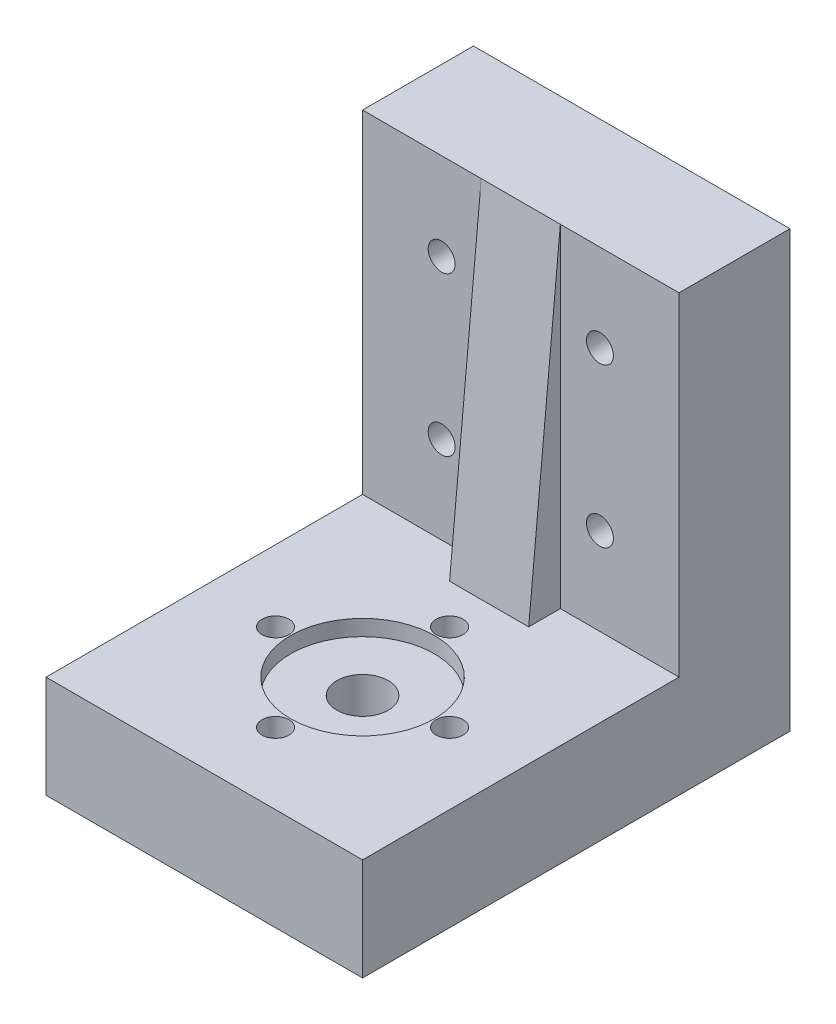
ISO-10303-21;
HEADER;
FILE_DESCRIPTION(('STEP AP214'),'2;1');
FILE_NAME('part.step','',(''),(''),'','','');
FILE_SCHEMA(('AUTOMOTIVE_DESIGN { 1 0 10303 214 1 1 1 1 }'));
ENDSEC;
DATA;
#1=APPLICATION_CONTEXT('core data for automotive mechanical design processes');
#2=APPLICATION_PROTOCOL_DEFINITION('international standard','automotive_design',2000,#1);
#3=PRODUCT_CONTEXT('',#1,'mechanical');
#4=PRODUCT('Part','Part','',(#3));
#5=PRODUCT_RELATED_PRODUCT_CATEGORY('part','',(#4));
#6=PRODUCT_DEFINITION_FORMATION('','',#4);
#7=PRODUCT_DEFINITION_CONTEXT('part definition',#1,'design');
#8=PRODUCT_DEFINITION('design','',#6,#7);
#9=PRODUCT_DEFINITION_SHAPE('','',#8);
#10=(LENGTH_UNIT() NAMED_UNIT(*) SI_UNIT(.MILLI.,.METRE.));
#11=(NAMED_UNIT(*) PLANE_ANGLE_UNIT() SI_UNIT($,.RADIAN.));
#12=(NAMED_UNIT(*) SI_UNIT($,.STERADIAN.) SOLID_ANGLE_UNIT());
#13=UNCERTAINTY_MEASURE_WITH_UNIT(LENGTH_MEASURE(1.E-05),#10,'distance_accuracy_value','');
#14=(GEOMETRIC_REPRESENTATION_CONTEXT(3) GLOBAL_UNCERTAINTY_ASSIGNED_CONTEXT((#13)) GLOBAL_UNIT_ASSIGNED_CONTEXT((#10,
#11,#12)) REPRESENTATION_CONTEXT('',''));
#15=CARTESIAN_POINT('',(0.,0.,0.));
#16=DIRECTION('',(0.,0.,1.));
#17=DIRECTION('',(1.,0.,0.));
#18=AXIS2_PLACEMENT_3D('',#15,#16,#17);
#19=CARTESIAN_POINT('',(20.,-14.9081147540984,-10.9095901639344));
#20=DIRECTION('',(0.,0.,-1.));
#21=DIRECTION('',(0.,1.,0.));
#22=AXIS2_PLACEMENT_3D('',#19,#20,#21);
#23=PLANE('',#22);
#24=CARTESIAN_POINT('',(10.,16.1268852459017,-10.9095901639344));
#25=DIRECTION('',(0.,0.,1.));
#26=DIRECTION('',(1.,0.,0.));
#27=AXIS2_PLACEMENT_3D('',#24,#25,#26);
#28=CIRCLE('',#27,1.7);
#29=CARTESIAN_POINT('',(11.7,16.1268852459017,-10.9095901639344));
#30=VERTEX_POINT('',#29);
#31=EDGE_CURVE('E145',#30,#30,#28,.T.);
#32=ORIENTED_EDGE('',*,*,#31,.F.);
#33=EDGE_LOOP('',(#32));
#34=FACE_BOUND('',#33,.T.);
#35=CARTESIAN_POINT('',(10.0000000000002,-3.87311475409835,-10.9095901639344));
#36=DIRECTION('',(0.,0.,1.));
#37=DIRECTION('',(1.,0.,0.));
#38=AXIS2_PLACEMENT_3D('',#35,#36,#37);
#39=CIRCLE('',#38,1.7);
#40=CARTESIAN_POINT('',(11.7000000000002,-3.87311475409835,-10.9095901639344));
#41=VERTEX_POINT('',#40);
#42=EDGE_CURVE('E148',#41,#41,#39,.T.);
#43=ORIENTED_EDGE('',*,*,#42,.F.);
#44=EDGE_LOOP('',(#43));
#45=FACE_BOUND('',#44,.T.);
#46=DIRECTION('',(0.,1.,0.));
#47=VECTOR('',#46,1.);
#48=CARTESIAN_POINT('',(5.,-14.9081147540984,-10.9095901639344));
#49=LINE('',#48,#47);
#50=CARTESIAN_POINT('',(5.,-14.9081147540984,-10.9095901639344));
#51=VERTEX_POINT('',#50);
#52=CARTESIAN_POINT('',(5.,27.1618852459017,-10.9095901639344));
#53=VERTEX_POINT('',#52);
#54=EDGE_CURVE('E121',#51,#53,#49,.T.);
#55=ORIENTED_EDGE('',*,*,#54,.F.);
#56=DIRECTION('',(-1.,0.,0.));
#57=VECTOR('',#56,1.);
#58=CARTESIAN_POINT('',(20.,-14.9081147540984,-10.9095901639344));
#59=LINE('',#58,#57);
#60=CARTESIAN_POINT('',(20.,-14.9081147540984,-10.9095901639344));
#61=VERTEX_POINT('',#60);
#62=EDGE_CURVE('E115',#61,#51,#59,.T.);
#63=ORIENTED_EDGE('',*,*,#62,.F.);
#64=DIRECTION('',(0.,-1.,0.));
#65=VECTOR('',#64,1.);
#66=CARTESIAN_POINT('',(20.,-14.9081147540984,-10.9095901639344));
#67=LINE('',#66,#65);
#68=CARTESIAN_POINT('',(20.,27.1618852459017,-10.9095901639344));
#69=VERTEX_POINT('',#68);
#70=EDGE_CURVE('E205',#69,#61,#67,.T.);
#71=ORIENTED_EDGE('',*,*,#70,.F.);
#72=DIRECTION('',(-1.,0.,0.));
#73=VECTOR('',#72,1.);
#74=CARTESIAN_POINT('',(20.,27.1618852459017,-10.9095901639344));
#75=LINE('',#74,#73);
#76=EDGE_CURVE('E11',#69,#53,#75,.T.);
#77=ORIENTED_EDGE('',*,*,#76,.T.);
#78=EDGE_LOOP('',(#55,#63,#71,#77));
#79=FACE_BOUND('',#78,.T.);
#80=ADVANCED_FACE('F39',(#34,#45,#79),#23,.F.);
#81=CARTESIAN_POINT('',(0.,-27.8381147540984,9.09040983606557));
#82=DIRECTION('',(0.,1.,0.));
#83=DIRECTION('',(0.,0.,1.));
#84=AXIS2_PLACEMENT_3D('',#81,#82,#83);
#85=CYLINDRICAL_SURFACE('',#84,3.25);
#86=CARTESIAN_POINT('',(0.,-27.8381147540984,9.09040983606557));
#87=DIRECTION('',(0.,1.,0.));
#88=DIRECTION('',(0.,0.,1.));
#89=AXIS2_PLACEMENT_3D('',#86,#87,#88);
#90=CIRCLE('',#89,3.25);
#91=CARTESIAN_POINT('',(0.,-27.8381147540984,12.3404098360656));
#92=VERTEX_POINT('',#91);
#93=EDGE_CURVE('E194',#92,#92,#90,.T.);
#94=ORIENTED_EDGE('',*,*,#93,.F.);
#95=EDGE_LOOP('',(#94));
#96=FACE_BOUND('',#95,.T.);
#97=CARTESIAN_POINT('',(0.,-16.9081147540984,9.09040983606557));
#98=DIRECTION('',(0.,1.,0.));
#99=DIRECTION('',(0.,0.,1.));
#100=AXIS2_PLACEMENT_3D('',#97,#98,#99);
#101=CIRCLE('',#100,3.25);
#102=CARTESIAN_POINT('',(0.,-16.9081147540984,12.3404098360656));
#103=VERTEX_POINT('',#102);
#104=EDGE_CURVE('E43',#103,#103,#101,.F.);
#105=ORIENTED_EDGE('',*,*,#104,.F.);
#106=EDGE_LOOP('',(#105));
#107=FACE_BOUND('',#106,.T.);
#108=ADVANCED_FACE('F258',(#96,#107),#85,.F.);
#109=CARTESIAN_POINT('',(20.,27.1618852459017,-10.9095901639344));
#110=DIRECTION('',(0.,-1.,0.));
#111=DIRECTION('',(0.,0.,-1.));
#112=AXIS2_PLACEMENT_3D('',#109,#110,#111);
#113=PLANE('',#112);
#114=CARTESIAN_POINT('',(-5.,27.1618852459017,-10.9095901639344));
#115=VERTEX_POINT('',#114);
#116=CARTESIAN_POINT('',(-20.,27.1618852459017,-10.9095901639344));
#117=VERTEX_POINT('',#116);
#118=EDGE_CURVE('E48',#115,#117,#75,.T.);
#119=ORIENTED_EDGE('',*,*,#118,.F.);
#120=DIRECTION('',(-1.,0.,0.));
#121=VECTOR('',#120,1.);
#122=CARTESIAN_POINT('',(20.,27.1618852459017,-10.9095901639344));
#123=LINE('',#122,#121);
#124=EDGE_CURVE('E65',#115,#53,#123,.F.);
#125=ORIENTED_EDGE('',*,*,#124,.T.);
#126=ORIENTED_EDGE('',*,*,#76,.F.);
#127=DIRECTION('',(0.,0.,1.));
#128=VECTOR('',#127,1.);
#129=CARTESIAN_POINT('',(20.,27.1618852459017,-10.9095901639344));
#130=LINE('',#129,#128);
#131=CARTESIAN_POINT('',(20.,27.1618852459017,-24.9295901639344));
#132=VERTEX_POINT('',#131);
#133=EDGE_CURVE('E197',#132,#69,#130,.T.);
#134=ORIENTED_EDGE('',*,*,#133,.F.);
#135=DIRECTION('',(-1.,0.,0.));
#136=VECTOR('',#135,1.);
#137=CARTESIAN_POINT('',(20.,27.1618852459017,-24.9295901639344));
#138=LINE('',#137,#136);
#139=CARTESIAN_POINT('',(-20.,27.1618852459017,-24.9295901639344));
#140=VERTEX_POINT('',#139);
#141=EDGE_CURVE('E215',#132,#140,#138,.T.);
#142=ORIENTED_EDGE('',*,*,#141,.T.);
#143=DIRECTION('',(0.,0.,1.));
#144=VECTOR('',#143,1.);
#145=CARTESIAN_POINT('',(-20.,27.1618852459017,-10.9095901639344));
#146=LINE('',#145,#144);
#147=EDGE_CURVE('E198',#140,#117,#146,.T.);
#148=ORIENTED_EDGE('',*,*,#147,.T.);
#149=EDGE_LOOP('',(#119,#125,#126,#134,#142,#148));
#150=FACE_BOUND('',#149,.T.);
#151=ADVANCED_FACE('F41',(#150),#113,.F.);
#152=CARTESIAN_POINT('',(-9.99999999999979,-3.87311475409835,-10.9095901639344));
#153=DIRECTION('',(0.,0.,1.));
#154=DIRECTION('',(1.,0.,0.));
#155=AXIS2_PLACEMENT_3D('',#152,#153,#154);
#156=CIRCLE('',#155,1.7);
#157=CARTESIAN_POINT('',(-8.29999999999979,-3.87311475409835,-10.9095901639344));
#158=VERTEX_POINT('',#157);
#159=EDGE_CURVE('E154',#158,#158,#156,.T.);
#160=ORIENTED_EDGE('',*,*,#159,.F.);
#161=EDGE_LOOP('',(#160));
#162=FACE_BOUND('',#161,.T.);
#163=CARTESIAN_POINT('',(-10.,16.1268852459017,-10.9095901639344));
#164=DIRECTION('',(0.,0.,1.));
#165=DIRECTION('',(1.,0.,0.));
#166=AXIS2_PLACEMENT_3D('',#163,#164,#165);
#167=CIRCLE('',#166,1.7);
#168=CARTESIAN_POINT('',(-8.3,16.1268852459017,-10.9095901639344));
#169=VERTEX_POINT('',#168);
#170=EDGE_CURVE('E143',#169,#169,#167,.T.);
#171=ORIENTED_EDGE('',*,*,#170,.F.);
#172=EDGE_LOOP('',(#171));
#173=FACE_BOUND('',#172,.T.);
#174=CARTESIAN_POINT('',(-5.,-14.9081147540984,-10.9095901639344));
#175=VERTEX_POINT('',#174);
#176=CARTESIAN_POINT('',(-20.,-14.9081147540984,-10.9095901639344));
#177=VERTEX_POINT('',#176);
#178=EDGE_CURVE('E122',#175,#177,#59,.T.);
#179=ORIENTED_EDGE('',*,*,#178,.F.);
#180=DIRECTION('',(0.,1.,0.));
#181=VECTOR('',#180,1.);
#182=CARTESIAN_POINT('',(-5.,-14.9081147540984,-10.9095901639344));
#183=LINE('',#182,#181);
#184=EDGE_CURVE('E54',#175,#115,#183,.T.);
#185=ORIENTED_EDGE('',*,*,#184,.T.);
#186=ORIENTED_EDGE('',*,*,#118,.T.);
#187=DIRECTION('',(0.,-1.,0.));
#188=VECTOR('',#187,1.);
#189=CARTESIAN_POINT('',(-20.,-14.9081147540984,-10.9095901639344));
#190=LINE('',#189,#188);
#191=EDGE_CURVE('E214',#117,#177,#190,.T.);
#192=ORIENTED_EDGE('',*,*,#191,.T.);
#193=EDGE_LOOP('',(#179,#185,#186,#192));
#194=FACE_BOUND('',#193,.T.);
#195=ADVANCED_FACE('F241',(#162,#173,#194),#23,.F.);
#196=CARTESIAN_POINT('',(20.,-14.9081147540984,29.0904098360656));
#197=DIRECTION('',(0.,-1.,0.));
#198=DIRECTION('',(0.,0.,-1.));
#199=AXIS2_PLACEMENT_3D('',#196,#197,#198);
#200=PLANE('',#199);
#201=CARTESIAN_POINT('',(0.,-14.9081147540984,-1.90959016393443));
#202=DIRECTION('',(0.,1.,0.));
#203=DIRECTION('',(0.,0.,1.));
#204=AXIS2_PLACEMENT_3D('',#201,#202,#203);
#205=CIRCLE('',#204,1.7);
#206=CARTESIAN_POINT('',(0.,-14.9081147540984,-0.209590163934432));
#207=VERTEX_POINT('',#206);
#208=EDGE_CURVE('E167',#207,#207,#205,.T.);
#209=ORIENTED_EDGE('',*,*,#208,.F.);
#210=EDGE_LOOP('',(#209));
#211=FACE_BOUND('',#210,.T.);
#212=CARTESIAN_POINT('',(11.,-14.9081147540984,9.09040983606557));
#213=DIRECTION('',(0.,1.,0.));
#214=DIRECTION('',(0.,0.,1.));
#215=AXIS2_PLACEMENT_3D('',#212,#213,#214);
#216=CIRCLE('',#215,1.69999999999983);
#217=CARTESIAN_POINT('',(11.,-14.9081147540984,10.7904098360654));
#218=VERTEX_POINT('',#217);
#219=EDGE_CURVE('E173',#218,#218,#216,.T.);
#220=ORIENTED_EDGE('',*,*,#219,.F.);
#221=EDGE_LOOP('',(#220));
#222=FACE_BOUND('',#221,.T.);
#223=CARTESIAN_POINT('',(0.,-14.9081147540984,20.0904098360656));
#224=DIRECTION('',(0.,1.,0.));
#225=DIRECTION('',(0.,0.,1.));
#226=AXIS2_PLACEMENT_3D('',#223,#224,#225);
#227=CIRCLE('',#226,1.69999999999948);
#228=CARTESIAN_POINT('',(0.,-14.9081147540984,21.7904098360651));
#229=VERTEX_POINT('',#228);
#230=EDGE_CURVE('E177',#229,#229,#227,.T.);
#231=ORIENTED_EDGE('',*,*,#230,.F.);
#232=EDGE_LOOP('',(#231));
#233=FACE_BOUND('',#232,.T.);
#234=CARTESIAN_POINT('',(-11.,-14.9081147540984,9.09040983606557));
#235=DIRECTION('',(0.,1.,0.));
#236=DIRECTION('',(0.,0.,1.));
#237=AXIS2_PLACEMENT_3D('',#234,#235,#236);
#238=CIRCLE('',#237,1.69999999999973);
#239=CARTESIAN_POINT('',(-11.,-14.9081147540984,10.7904098360653));
#240=VERTEX_POINT('',#239);
#241=EDGE_CURVE('E184',#240,#240,#238,.T.);
#242=ORIENTED_EDGE('',*,*,#241,.F.);
#243=EDGE_LOOP('',(#242));
#244=FACE_BOUND('',#243,.T.);
#245=CARTESIAN_POINT('',(0.,-14.9081147540984,9.09040983606557));
#246=DIRECTION('',(0.,1.,0.));
#247=DIRECTION('',(0.,0.,1.));
#248=AXIS2_PLACEMENT_3D('',#245,#246,#247);
#249=CIRCLE('',#248,9.1);
#250=CARTESIAN_POINT('',(0.,-14.9081147540984,18.1904098360656));
#251=VERTEX_POINT('',#250);
#252=EDGE_CURVE('E169',#251,#251,#249,.T.);
#253=ORIENTED_EDGE('',*,*,#252,.F.);
#254=EDGE_LOOP('',(#253));
#255=FACE_BOUND('',#254,.T.);
#256=DIRECTION('',(1.,0.,0.));
#257=VECTOR('',#256,1.);
#258=CARTESIAN_POINT('',(20.,-14.9081147540984,-6.90959016393443));
#259=LINE('',#258,#257);
#260=CARTESIAN_POINT('',(5.,-14.9081147540984,-6.90959016393443));
#261=VERTEX_POINT('',#260);
#262=CARTESIAN_POINT('',(-5.,-14.9081147540984,-6.90959016393443));
#263=VERTEX_POINT('',#262);
#264=EDGE_CURVE('E139',#261,#263,#259,.F.);
#265=ORIENTED_EDGE('',*,*,#264,.T.);
#266=DIRECTION('',(0.,0.,-1.));
#267=VECTOR('',#266,1.);
#268=CARTESIAN_POINT('',(-5.,-14.9081147540984,29.0904098360656));
#269=LINE('',#268,#267);
#270=EDGE_CURVE('E133',#263,#175,#269,.T.);
#271=ORIENTED_EDGE('',*,*,#270,.T.);
#272=ORIENTED_EDGE('',*,*,#178,.T.);
#273=DIRECTION('',(0.,0.,1.));
#274=VECTOR('',#273,1.);
#275=CARTESIAN_POINT('',(-20.,-14.9081147540984,29.0904098360656));
#276=LINE('',#275,#274);
#277=CARTESIAN_POINT('',(-20.,-14.9081147540984,29.0904098360656));
#278=VERTEX_POINT('',#277);
#279=EDGE_CURVE('E218',#177,#278,#276,.T.);
#280=ORIENTED_EDGE('',*,*,#279,.T.);
#281=DIRECTION('',(-1.,0.,0.));
#282=VECTOR('',#281,1.);
#283=CARTESIAN_POINT('',(20.,-14.9081147540984,29.0904098360656));
#284=LINE('',#283,#282);
#285=CARTESIAN_POINT('',(20.,-14.9081147540984,29.0904098360656));
#286=VERTEX_POINT('',#285);
#287=EDGE_CURVE('E231',#286,#278,#284,.T.);
#288=ORIENTED_EDGE('',*,*,#287,.F.);
#289=DIRECTION('',(0.,0.,1.));
#290=VECTOR('',#289,1.);
#291=CARTESIAN_POINT('',(20.,-14.9081147540984,29.0904098360656));
#292=LINE('',#291,#290);
#293=EDGE_CURVE('E118',#61,#286,#292,.T.);
#294=ORIENTED_EDGE('',*,*,#293,.F.);
#295=ORIENTED_EDGE('',*,*,#62,.T.);
#296=DIRECTION('',(0.,0.,-1.));
#297=VECTOR('',#296,1.);
#298=CARTESIAN_POINT('',(5.,-14.9081147540984,29.0904098360656));
#299=LINE('',#298,#297);
#300=EDGE_CURVE('E116',#261,#51,#299,.T.);
#301=ORIENTED_EDGE('',*,*,#300,.F.);
#302=EDGE_LOOP('',(#265,#271,#272,#280,#288,#294,#295,#301));
#303=FACE_BOUND('',#302,.T.);
#304=ADVANCED_FACE('F112',(#211,#222,#233,#244,#255,#303),#200,.F.);
#305=CARTESIAN_POINT('',(20.,-27.8381147540984,29.0904098360656));
#306=DIRECTION('',(0.,0.,-1.));
#307=DIRECTION('',(-1.,0.,0.));
#308=AXIS2_PLACEMENT_3D('',#305,#306,#307);
#309=PLANE('',#308);
#310=DIRECTION('',(0.,-1.,0.));
#311=VECTOR('',#310,1.);
#312=CARTESIAN_POINT('',(-20.,-27.8381147540984,29.0904098360656));
#313=LINE('',#312,#311);
#314=CARTESIAN_POINT('',(-20.,-27.8381147540984,29.0904098360656));
#315=VERTEX_POINT('',#314);
#316=EDGE_CURVE('E219',#278,#315,#313,.T.);
#317=ORIENTED_EDGE('',*,*,#316,.T.);
#318=DIRECTION('',(-1.,0.,0.));
#319=VECTOR('',#318,1.);
#320=CARTESIAN_POINT('',(20.,-27.8381147540984,29.0904098360656));
#321=LINE('',#320,#319);
#322=CARTESIAN_POINT('',(20.,-27.8381147540984,29.0904098360656));
#323=VERTEX_POINT('',#322);
#324=EDGE_CURVE('E229',#323,#315,#321,.T.);
#325=ORIENTED_EDGE('',*,*,#324,.F.);
#326=DIRECTION('',(0.,-1.,0.));
#327=VECTOR('',#326,1.);
#328=CARTESIAN_POINT('',(20.,-27.8381147540984,29.0904098360656));
#329=LINE('',#328,#327);
#330=EDGE_CURVE('E207',#286,#323,#329,.T.);
#331=ORIENTED_EDGE('',*,*,#330,.F.);
#332=ORIENTED_EDGE('',*,*,#287,.T.);
#333=EDGE_LOOP('',(#317,#325,#331,#332));
#334=FACE_BOUND('',#333,.T.);
#335=ADVANCED_FACE('F247',(#334),#309,.F.);
#336=CARTESIAN_POINT('',(20.,-27.8381147540983,-24.9295901639344));
#337=DIRECTION('',(0.,1.,0.));
#338=DIRECTION('',(0.,0.,1.));
#339=AXIS2_PLACEMENT_3D('',#336,#337,#338);
#340=PLANE('',#339);
#341=CARTESIAN_POINT('',(0.,-27.8381147540984,-1.90959016393443));
#342=DIRECTION('',(0.,1.,0.));
#343=DIRECTION('',(0.,0.,1.));
#344=AXIS2_PLACEMENT_3D('',#341,#342,#343);
#345=CIRCLE('',#344,1.7);
#346=CARTESIAN_POINT('',(0.,-27.8381147540984,-0.209590163934433));
#347=VERTEX_POINT('',#346);
#348=EDGE_CURVE('E168',#347,#347,#345,.T.);
#349=ORIENTED_EDGE('',*,*,#348,.T.);
#350=EDGE_LOOP('',(#349));
#351=FACE_BOUND('',#350,.T.);
#352=CARTESIAN_POINT('',(11.,-27.8381147540984,9.09040983606557));
#353=DIRECTION('',(0.,1.,0.));
#354=DIRECTION('',(0.,0.,1.));
#355=AXIS2_PLACEMENT_3D('',#352,#353,#354);
#356=CIRCLE('',#355,1.69999999999983);
#357=CARTESIAN_POINT('',(11.,-27.8381147540984,10.7904098360654));
#358=VERTEX_POINT('',#357);
#359=EDGE_CURVE('E176',#358,#358,#356,.T.);
#360=ORIENTED_EDGE('',*,*,#359,.T.);
#361=EDGE_LOOP('',(#360));
#362=FACE_BOUND('',#361,.T.);
#363=CARTESIAN_POINT('',(0.,-27.8381147540984,20.0904098360656));
#364=DIRECTION('',(0.,1.,0.));
#365=DIRECTION('',(0.,0.,1.));
#366=AXIS2_PLACEMENT_3D('',#363,#364,#365);
#367=CIRCLE('',#366,1.69999999999948);
#368=CARTESIAN_POINT('',(0.,-27.8381147540984,21.7904098360651));
#369=VERTEX_POINT('',#368);
#370=EDGE_CURVE('E185',#369,#369,#367,.T.);
#371=ORIENTED_EDGE('',*,*,#370,.T.);
#372=EDGE_LOOP('',(#371));
#373=FACE_BOUND('',#372,.T.);
#374=CARTESIAN_POINT('',(-11.,-27.8381147540984,9.09040983606557));
#375=DIRECTION('',(0.,1.,0.));
#376=DIRECTION('',(0.,0.,1.));
#377=AXIS2_PLACEMENT_3D('',#374,#375,#376);
#378=CIRCLE('',#377,1.69999999999973);
#379=CARTESIAN_POINT('',(-11.,-27.8381147540984,10.7904098360653));
#380=VERTEX_POINT('',#379);
#381=EDGE_CURVE('E161',#380,#380,#378,.T.);
#382=ORIENTED_EDGE('',*,*,#381,.T.);
#383=EDGE_LOOP('',(#382));
#384=FACE_BOUND('',#383,.T.);
#385=ORIENTED_EDGE('',*,*,#93,.T.);
#386=EDGE_LOOP('',(#385));
#387=FACE_BOUND('',#386,.T.);
#388=DIRECTION('',(0.,0.,-1.));
#389=VECTOR('',#388,1.);
#390=CARTESIAN_POINT('',(-20.,-27.8381147540983,-24.9295901639344));
#391=LINE('',#390,#389);
#392=CARTESIAN_POINT('',(-20.,-27.8381147540983,-24.9295901639344));
#393=VERTEX_POINT('',#392);
#394=EDGE_CURVE('E225',#315,#393,#391,.T.);
#395=ORIENTED_EDGE('',*,*,#394,.T.);
#396=DIRECTION('',(-1.,0.,0.));
#397=VECTOR('',#396,1.);
#398=CARTESIAN_POINT('',(20.,-27.8381147540983,-24.9295901639344));
#399=LINE('',#398,#397);
#400=CARTESIAN_POINT('',(20.,-27.8381147540983,-24.9295901639344));
#401=VERTEX_POINT('',#400);
#402=EDGE_CURVE('E226',#401,#393,#399,.T.);
#403=ORIENTED_EDGE('',*,*,#402,.F.);
#404=DIRECTION('',(0.,0.,-1.));
#405=VECTOR('',#404,1.);
#406=CARTESIAN_POINT('',(20.,-27.8381147540983,-24.9295901639344));
#407=LINE('',#406,#405);
#408=EDGE_CURVE('E206',#323,#401,#407,.T.);
#409=ORIENTED_EDGE('',*,*,#408,.F.);
#410=ORIENTED_EDGE('',*,*,#324,.T.);
#411=EDGE_LOOP('',(#395,#403,#409,#410));
#412=FACE_BOUND('',#411,.T.);
#413=ADVANCED_FACE('F252',(#351,#362,#373,#384,#387,#412),#340,.F.);
#414=CARTESIAN_POINT('',(20.,27.1618852459017,-24.9295901639344));
#415=DIRECTION('',(0.,0.,1.));
#416=DIRECTION('',(0.,-1.,0.));
#417=AXIS2_PLACEMENT_3D('',#414,#415,#416);
#418=PLANE('',#417);
#419=CARTESIAN_POINT('',(-9.99999999999979,-3.87311475409835,-24.9295901639344));
#420=DIRECTION('',(0.,0.,1.));
#421=DIRECTION('',(1.,0.,0.));
#422=AXIS2_PLACEMENT_3D('',#419,#420,#421);
#423=CIRCLE('',#422,1.7);
#424=CARTESIAN_POINT('',(-8.29999999999979,-3.87311475409835,-24.9295901639344));
#425=VERTEX_POINT('',#424);
#426=EDGE_CURVE('E142',#425,#425,#423,.T.);
#427=ORIENTED_EDGE('',*,*,#426,.T.);
#428=EDGE_LOOP('',(#427));
#429=FACE_BOUND('',#428,.T.);
#430=CARTESIAN_POINT('',(-10.,16.1268852459017,-24.9295901639344));
#431=DIRECTION('',(0.,0.,1.));
#432=DIRECTION('',(1.,0.,0.));
#433=AXIS2_PLACEMENT_3D('',#430,#431,#432);
#434=CIRCLE('',#433,1.7);
#435=CARTESIAN_POINT('',(-8.3,16.1268852459017,-24.9295901639344));
#436=VERTEX_POINT('',#435);
#437=EDGE_CURVE('E158',#436,#436,#434,.T.);
#438=ORIENTED_EDGE('',*,*,#437,.T.);
#439=EDGE_LOOP('',(#438));
#440=FACE_BOUND('',#439,.T.);
#441=DIRECTION('',(0.,1.,0.));
#442=VECTOR('',#441,1.);
#443=CARTESIAN_POINT('',(-20.,27.1618852459017,-24.9295901639344));
#444=LINE('',#443,#442);
#445=EDGE_CURVE('E204',#393,#140,#444,.T.);
#446=ORIENTED_EDGE('',*,*,#445,.T.);
#447=ORIENTED_EDGE('',*,*,#141,.F.);
#448=DIRECTION('',(0.,1.,0.));
#449=VECTOR('',#448,1.);
#450=CARTESIAN_POINT('',(20.,27.1618852459017,-24.9295901639344));
#451=LINE('',#450,#449);
#452=EDGE_CURVE('E208',#401,#132,#451,.T.);
#453=ORIENTED_EDGE('',*,*,#452,.F.);
#454=ORIENTED_EDGE('',*,*,#402,.T.);
#455=EDGE_LOOP('',(#446,#447,#453,#454));
#456=FACE_BOUND('',#455,.T.);
#457=CARTESIAN_POINT('',(10.,16.1268852459017,-24.9295901639344));
#458=DIRECTION('',(0.,0.,1.));
#459=DIRECTION('',(1.,0.,0.));
#460=AXIS2_PLACEMENT_3D('',#457,#458,#459);
#461=CIRCLE('',#460,1.7);
#462=CARTESIAN_POINT('',(11.7,16.1268852459017,-24.9295901639344));
#463=VERTEX_POINT('',#462);
#464=EDGE_CURVE('E146',#463,#463,#461,.T.);
#465=ORIENTED_EDGE('',*,*,#464,.T.);
#466=EDGE_LOOP('',(#465));
#467=FACE_BOUND('',#466,.T.);
#468=CARTESIAN_POINT('',(10.0000000000002,-3.87311475409835,-24.9295901639344));
#469=DIRECTION('',(0.,0.,1.));
#470=DIRECTION('',(1.,0.,0.));
#471=AXIS2_PLACEMENT_3D('',#468,#469,#470);
#472=CIRCLE('',#471,1.7);
#473=CARTESIAN_POINT('',(11.7000000000002,-3.87311475409835,-24.9295901639344));
#474=VERTEX_POINT('',#473);
#475=EDGE_CURVE('E155',#474,#474,#472,.T.);
#476=ORIENTED_EDGE('',*,*,#475,.T.);
#477=EDGE_LOOP('',(#476));
#478=FACE_BOUND('',#477,.T.);
#479=ADVANCED_FACE('F285',(#429,#440,#456,#467,#478),#418,.F.);
#480=CARTESIAN_POINT('',(20.,0.,0.));
#481=DIRECTION('',(-1.,0.,0.));
#482=DIRECTION('',(0.,0.,1.));
#483=AXIS2_PLACEMENT_3D('',#480,#481,#482);
#484=PLANE('',#483);
#485=ORIENTED_EDGE('',*,*,#133,.T.);
#486=ORIENTED_EDGE('',*,*,#70,.T.);
#487=ORIENTED_EDGE('',*,*,#293,.T.);
#488=ORIENTED_EDGE('',*,*,#330,.T.);
#489=ORIENTED_EDGE('',*,*,#408,.T.);
#490=ORIENTED_EDGE('',*,*,#452,.T.);
#491=EDGE_LOOP('',(#485,#486,#487,#488,#489,#490));
#492=FACE_BOUND('',#491,.T.);
#493=ADVANCED_FACE('F253',(#492),#484,.F.);
#494=CARTESIAN_POINT('',(-20.,0.,0.));
#495=DIRECTION('',(-1.,0.,0.));
#496=DIRECTION('',(0.,0.,1.));
#497=AXIS2_PLACEMENT_3D('',#494,#495,#496);
#498=PLANE('',#497);
#499=ORIENTED_EDGE('',*,*,#147,.F.);
#500=ORIENTED_EDGE('',*,*,#445,.F.);
#501=ORIENTED_EDGE('',*,*,#394,.F.);
#502=ORIENTED_EDGE('',*,*,#316,.F.);
#503=ORIENTED_EDGE('',*,*,#279,.F.);
#504=ORIENTED_EDGE('',*,*,#191,.F.);
#505=EDGE_LOOP('',(#499,#500,#501,#502,#503,#504));
#506=FACE_BOUND('',#505,.T.);
#507=ADVANCED_FACE('F242',(#506),#498,.T.);
#508=CARTESIAN_POINT('',(0.,-16.9081147540984,9.09040983606557));
#509=DIRECTION('',(0.,1.,0.));
#510=DIRECTION('',(0.,0.,1.));
#511=AXIS2_PLACEMENT_3D('',#508,#509,#510);
#512=PLANE('',#511);
#513=CARTESIAN_POINT('',(0.,-16.9081147540984,9.09040983606557));
#514=DIRECTION('',(0.,1.,0.));
#515=DIRECTION('',(0.,0.,1.));
#516=AXIS2_PLACEMENT_3D('',#513,#514,#515);
#517=CIRCLE('',#516,9.1);
#518=CARTESIAN_POINT('',(0.,-16.9081147540984,18.1904098360656));
#519=VERTEX_POINT('',#518);
#520=EDGE_CURVE('E188',#519,#519,#517,.T.);
#521=ORIENTED_EDGE('',*,*,#520,.T.);
#522=EDGE_LOOP('',(#521));
#523=FACE_BOUND('',#522,.T.);
#524=ORIENTED_EDGE('',*,*,#104,.T.);
#525=EDGE_LOOP('',(#524));
#526=FACE_BOUND('',#525,.T.);
#527=ADVANCED_FACE('F286',(#523,#526),#512,.T.);
#528=CARTESIAN_POINT('',(0.,-16.9081147540984,9.09040983606557));
#529=DIRECTION('',(0.,1.,0.));
#530=DIRECTION('',(0.,0.,1.));
#531=AXIS2_PLACEMENT_3D('',#528,#529,#530);
#532=CYLINDRICAL_SURFACE('',#531,9.1);
#533=ORIENTED_EDGE('',*,*,#520,.F.);
#534=EDGE_LOOP('',(#533));
#535=FACE_BOUND('',#534,.T.);
#536=ORIENTED_EDGE('',*,*,#252,.T.);
#537=EDGE_LOOP('',(#536));
#538=FACE_BOUND('',#537,.T.);
#539=ADVANCED_FACE('F292',(#535,#538),#532,.F.);
#540=CARTESIAN_POINT('',(-11.,-27.8381147540984,9.09040983606557));
#541=DIRECTION('',(0.,1.,0.));
#542=DIRECTION('',(0.,0.,1.));
#543=AXIS2_PLACEMENT_3D('',#540,#541,#542);
#544=CYLINDRICAL_SURFACE('',#543,1.69999999999973);
#545=ORIENTED_EDGE('',*,*,#381,.F.);
#546=EDGE_LOOP('',(#545));
#547=FACE_BOUND('',#546,.T.);
#548=ORIENTED_EDGE('',*,*,#241,.T.);
#549=EDGE_LOOP('',(#548));
#550=FACE_BOUND('',#549,.T.);
#551=ADVANCED_FACE('F294',(#547,#550),#544,.F.);
#552=CARTESIAN_POINT('',(0.,-27.8381147540984,20.0904098360656));
#553=DIRECTION('',(0.,1.,0.));
#554=DIRECTION('',(0.,0.,1.));
#555=AXIS2_PLACEMENT_3D('',#552,#553,#554);
#556=CYLINDRICAL_SURFACE('',#555,1.69999999999948);
#557=ORIENTED_EDGE('',*,*,#370,.F.);
#558=EDGE_LOOP('',(#557));
#559=FACE_BOUND('',#558,.T.);
#560=ORIENTED_EDGE('',*,*,#230,.T.);
#561=EDGE_LOOP('',(#560));
#562=FACE_BOUND('',#561,.T.);
#563=ADVANCED_FACE('F305',(#559,#562),#556,.F.);
#564=CARTESIAN_POINT('',(11.,-27.8381147540984,9.09040983606557));
#565=DIRECTION('',(0.,1.,0.));
#566=DIRECTION('',(0.,0.,1.));
#567=AXIS2_PLACEMENT_3D('',#564,#565,#566);
#568=CYLINDRICAL_SURFACE('',#567,1.69999999999983);
#569=ORIENTED_EDGE('',*,*,#359,.F.);
#570=EDGE_LOOP('',(#569));
#571=FACE_BOUND('',#570,.T.);
#572=ORIENTED_EDGE('',*,*,#219,.T.);
#573=EDGE_LOOP('',(#572));
#574=FACE_BOUND('',#573,.T.);
#575=ADVANCED_FACE('F306',(#571,#574),#568,.F.);
#576=CARTESIAN_POINT('',(0.,-27.8381147540984,-1.90959016393443));
#577=DIRECTION('',(0.,1.,0.));
#578=DIRECTION('',(0.,0.,1.));
#579=AXIS2_PLACEMENT_3D('',#576,#577,#578);
#580=CYLINDRICAL_SURFACE('',#579,1.7);
#581=ORIENTED_EDGE('',*,*,#348,.F.);
#582=EDGE_LOOP('',(#581));
#583=FACE_BOUND('',#582,.T.);
#584=ORIENTED_EDGE('',*,*,#208,.T.);
#585=EDGE_LOOP('',(#584));
#586=FACE_BOUND('',#585,.T.);
#587=ADVANCED_FACE('F309',(#583,#586),#580,.F.);
#588=CARTESIAN_POINT('',(-10.,16.1268852459017,-24.9295901639344));
#589=DIRECTION('',(0.,0.,1.));
#590=DIRECTION('',(1.,0.,0.));
#591=AXIS2_PLACEMENT_3D('',#588,#589,#590);
#592=CYLINDRICAL_SURFACE('',#591,1.7);
#593=ORIENTED_EDGE('',*,*,#437,.F.);
#594=EDGE_LOOP('',(#593));
#595=FACE_BOUND('',#594,.T.);
#596=ORIENTED_EDGE('',*,*,#170,.T.);
#597=EDGE_LOOP('',(#596));
#598=FACE_BOUND('',#597,.T.);
#599=ADVANCED_FACE('F313',(#595,#598),#592,.F.);
#600=CARTESIAN_POINT('',(10.,16.1268852459017,-24.9295901639344));
#601=DIRECTION('',(0.,0.,1.));
#602=DIRECTION('',(1.,0.,0.));
#603=AXIS2_PLACEMENT_3D('',#600,#601,#602);
#604=CYLINDRICAL_SURFACE('',#603,1.7);
#605=ORIENTED_EDGE('',*,*,#464,.F.);
#606=EDGE_LOOP('',(#605));
#607=FACE_BOUND('',#606,.T.);
#608=ORIENTED_EDGE('',*,*,#31,.T.);
#609=EDGE_LOOP('',(#608));
#610=FACE_BOUND('',#609,.T.);
#611=ADVANCED_FACE('F319',(#607,#610),#604,.F.);
#612=CARTESIAN_POINT('',(10.0000000000002,-3.87311475409835,-24.9295901639344));
#613=DIRECTION('',(0.,0.,1.));
#614=DIRECTION('',(1.,0.,0.));
#615=AXIS2_PLACEMENT_3D('',#612,#613,#614);
#616=CYLINDRICAL_SURFACE('',#615,1.7);
#617=ORIENTED_EDGE('',*,*,#475,.F.);
#618=EDGE_LOOP('',(#617));
#619=FACE_BOUND('',#618,.T.);
#620=ORIENTED_EDGE('',*,*,#42,.T.);
#621=EDGE_LOOP('',(#620));
#622=FACE_BOUND('',#621,.T.);
#623=ADVANCED_FACE('F322',(#619,#622),#616,.F.);
#624=CARTESIAN_POINT('',(-9.99999999999979,-3.87311475409835,-24.9295901639344));
#625=DIRECTION('',(0.,0.,1.));
#626=DIRECTION('',(1.,0.,0.));
#627=AXIS2_PLACEMENT_3D('',#624,#625,#626);
#628=CYLINDRICAL_SURFACE('',#627,1.7);
#629=ORIENTED_EDGE('',*,*,#426,.F.);
#630=EDGE_LOOP('',(#629));
#631=FACE_BOUND('',#630,.T.);
#632=ORIENTED_EDGE('',*,*,#159,.T.);
#633=EDGE_LOOP('',(#632));
#634=FACE_BOUND('',#633,.T.);
#635=ADVANCED_FACE('F318',(#631,#634),#628,.F.);
#636=CARTESIAN_POINT('',(0.,27.1618852459017,-10.9095901639344));
#637=DIRECTION('',(0.,-0.0946527548861888,-0.995510349515491));
#638=DIRECTION('',(0.,-0.995510349515491,0.0946527548861888));
#639=AXIS2_PLACEMENT_3D('',#636,#637,#638);
#640=PLANE('',#639);
#641=ORIENTED_EDGE('',*,*,#124,.F.);
#642=DIRECTION('',(0.,-0.995510349515491,0.0946527548861888));
#643=VECTOR('',#642,1.);
#644=CARTESIAN_POINT('',(-5.,27.1618852459017,-10.9095901639344));
#645=LINE('',#644,#643);
#646=EDGE_CURVE('E127',#115,#263,#645,.T.);
#647=ORIENTED_EDGE('',*,*,#646,.T.);
#648=ORIENTED_EDGE('',*,*,#264,.F.);
#649=DIRECTION('',(0.,-0.995510349515491,0.0946527548861888));
#650=VECTOR('',#649,1.);
#651=CARTESIAN_POINT('',(5.,27.1618852459017,-10.9095901639344));
#652=LINE('',#651,#650);
#653=EDGE_CURVE('E131',#53,#261,#652,.T.);
#654=ORIENTED_EDGE('',*,*,#653,.F.);
#655=EDGE_LOOP('',(#641,#647,#648,#654));
#656=FACE_BOUND('',#655,.T.);
#657=ADVANCED_FACE('F325',(#656),#640,.F.);
#658=CARTESIAN_POINT('',(-5.,-0.33811475409835,2.08040983606557));
#659=DIRECTION('',(-1.,0.,0.));
#660=DIRECTION('',(0.,0.,1.));
#661=AXIS2_PLACEMENT_3D('',#658,#659,#660);
#662=PLANE('',#661);
#663=ORIENTED_EDGE('',*,*,#646,.F.);
#664=ORIENTED_EDGE('',*,*,#184,.F.);
#665=ORIENTED_EDGE('',*,*,#270,.F.);
#666=EDGE_LOOP('',(#663,#664,#665));
#667=FACE_BOUND('',#666,.T.);
#668=ADVANCED_FACE('F334',(#667),#662,.T.);
#669=CARTESIAN_POINT('',(5.,-0.33811475409835,2.08040983606557));
#670=DIRECTION('',(-1.,0.,0.));
#671=DIRECTION('',(0.,0.,1.));
#672=AXIS2_PLACEMENT_3D('',#669,#670,#671);
#673=PLANE('',#672);
#674=ORIENTED_EDGE('',*,*,#653,.T.);
#675=ORIENTED_EDGE('',*,*,#300,.T.);
#676=ORIENTED_EDGE('',*,*,#54,.T.);
#677=EDGE_LOOP('',(#674,#675,#676));
#678=FACE_BOUND('',#677,.T.);
#679=ADVANCED_FACE('F129',(#678),#673,.F.);
#680=CLOSED_SHELL('',(#80,#108,#151,#195,#304,#335,#413,#479,#493,#507,#527,#539,#551,#563,#575,
#587,#599,#611,#623,#635,#657,#668,#679));
#681=MANIFOLD_SOLID_BREP('B2',#680);
#682=ADVANCED_BREP_SHAPE_REPRESENTATION('',(#18,#681),#14);
#683=SHAPE_DEFINITION_REPRESENTATION(#9,#682);
ENDSEC;
END-ISO-10303-21;
